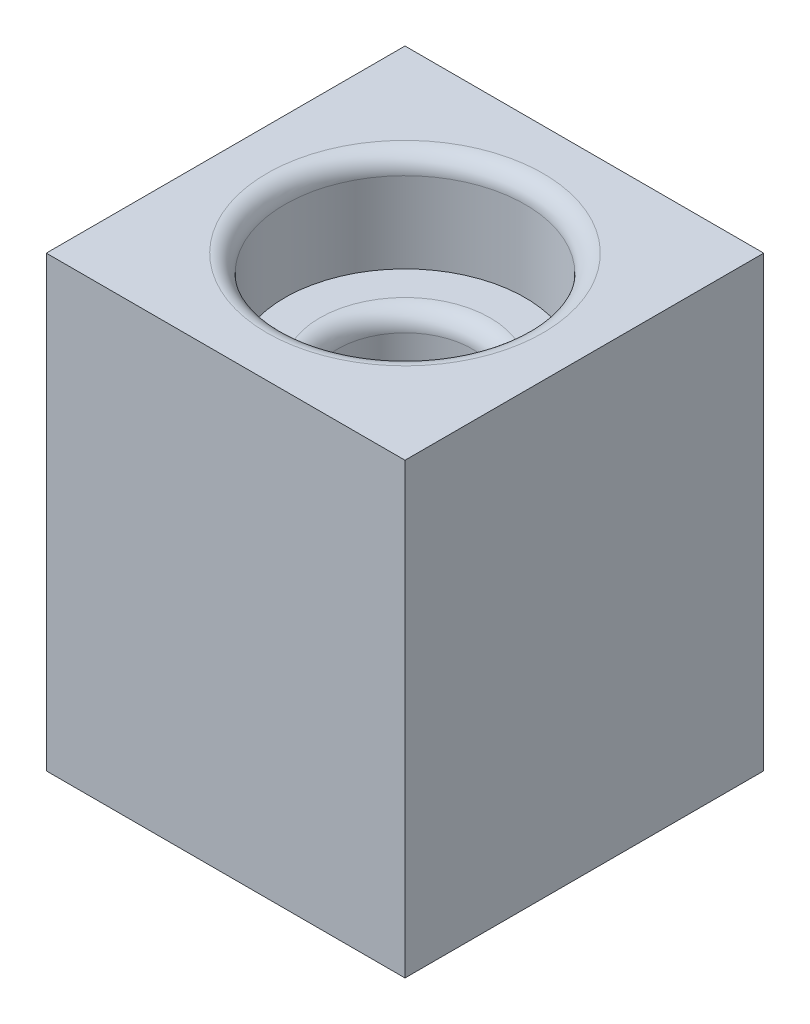
ISO-10303-21;
HEADER;
FILE_DESCRIPTION(('STEP AP214'),'2;1');
FILE_NAME('part.step','',(''),(''),'','','');
FILE_SCHEMA(('AUTOMOTIVE_DESIGN { 1 0 10303 214 1 1 1 1 }'));
ENDSEC;
DATA;
#1=APPLICATION_CONTEXT('core data for automotive mechanical design processes');
#2=APPLICATION_PROTOCOL_DEFINITION('international standard','automotive_design',2000,#1);
#3=PRODUCT_CONTEXT('',#1,'mechanical');
#4=PRODUCT('Part','Part','',(#3));
#5=PRODUCT_RELATED_PRODUCT_CATEGORY('part','',(#4));
#6=PRODUCT_DEFINITION_FORMATION('','',#4);
#7=PRODUCT_DEFINITION_CONTEXT('part definition',#1,'design');
#8=PRODUCT_DEFINITION('design','',#6,#7);
#9=PRODUCT_DEFINITION_SHAPE('','',#8);
#10=(LENGTH_UNIT() NAMED_UNIT(*) SI_UNIT(.MILLI.,.METRE.));
#11=(NAMED_UNIT(*) PLANE_ANGLE_UNIT() SI_UNIT($,.RADIAN.));
#12=(NAMED_UNIT(*) SI_UNIT($,.STERADIAN.) SOLID_ANGLE_UNIT());
#13=UNCERTAINTY_MEASURE_WITH_UNIT(LENGTH_MEASURE(1.E-05),#10,'distance_accuracy_value','');
#14=(GEOMETRIC_REPRESENTATION_CONTEXT(3) GLOBAL_UNCERTAINTY_ASSIGNED_CONTEXT((#13)) GLOBAL_UNIT_ASSIGNED_CONTEXT((#10,
#11,#12)) REPRESENTATION_CONTEXT('',''));
#15=CARTESIAN_POINT('',(0.,0.,0.));
#16=DIRECTION('',(0.,0.,1.));
#17=DIRECTION('',(1.,0.,0.));
#18=AXIS2_PLACEMENT_3D('',#15,#16,#17);
#19=CARTESIAN_POINT('',(0.,0.,0.));
#20=DIRECTION('',(0.,1.,0.));
#21=DIRECTION('',(0.,0.,1.));
#22=AXIS2_PLACEMENT_3D('',#19,#20,#21);
#23=CYLINDRICAL_SURFACE('',#22,3.75);
#24=CARTESIAN_POINT('',(0.,18.5,0.));
#25=DIRECTION('',(0.,1.,0.));
#26=DIRECTION('',(0.,0.,1.));
#27=AXIS2_PLACEMENT_3D('',#24,#25,#26);
#28=CIRCLE('',#27,3.75);
#29=CARTESIAN_POINT('',(0.,18.5,3.75));
#30=VERTEX_POINT('',#29);
#31=EDGE_CURVE('E42',#30,#30,#28,.T.);
#32=ORIENTED_EDGE('',*,*,#31,.T.);
#33=EDGE_LOOP('',(#32));
#34=FACE_BOUND('',#33,.T.);
#35=CARTESIAN_POINT('',(0.,6.5,0.));
#36=DIRECTION('',(0.,1.,0.));
#37=DIRECTION('',(0.,0.,1.));
#38=AXIS2_PLACEMENT_3D('',#35,#36,#37);
#39=CIRCLE('',#38,3.75);
#40=CARTESIAN_POINT('',(0.,6.5,3.75));
#41=VERTEX_POINT('',#40);
#42=EDGE_CURVE('E126',#41,#41,#39,.F.);
#43=ORIENTED_EDGE('',*,*,#42,.T.);
#44=EDGE_LOOP('',(#43));
#45=FACE_BOUND('',#44,.T.);
#46=ADVANCED_FACE('F33',(#34,#45),#23,.F.);
#47=CARTESIAN_POINT('',(-10.,25.,-10.));
#48=DIRECTION('',(1.,0.,0.));
#49=DIRECTION('',(0.,0.,-1.));
#50=AXIS2_PLACEMENT_3D('',#47,#48,#49);
#51=PLANE('',#50);
#52=DIRECTION('',(0.,0.,1.));
#53=VECTOR('',#52,1.);
#54=CARTESIAN_POINT('',(-10.,0.,-10.));
#55=LINE('',#54,#53);
#56=CARTESIAN_POINT('',(-10.,0.,-10.));
#57=VERTEX_POINT('',#56);
#58=CARTESIAN_POINT('',(-10.,0.,10.));
#59=VERTEX_POINT('',#58);
#60=EDGE_CURVE('E101',#57,#59,#55,.T.);
#61=ORIENTED_EDGE('',*,*,#60,.T.);
#62=DIRECTION('',(0.,-1.,0.));
#63=VECTOR('',#62,1.);
#64=CARTESIAN_POINT('',(-10.,25.,10.));
#65=LINE('',#64,#63);
#66=CARTESIAN_POINT('',(-10.,25.,10.));
#67=VERTEX_POINT('',#66);
#68=EDGE_CURVE('E92',#67,#59,#65,.T.);
#69=ORIENTED_EDGE('',*,*,#68,.F.);
#70=DIRECTION('',(0.,0.,1.));
#71=VECTOR('',#70,1.);
#72=CARTESIAN_POINT('',(-10.,25.,-10.));
#73=LINE('',#72,#71);
#74=CARTESIAN_POINT('',(-10.,25.,-10.));
#75=VERTEX_POINT('',#74);
#76=EDGE_CURVE('E86',#75,#67,#73,.T.);
#77=ORIENTED_EDGE('',*,*,#76,.F.);
#78=DIRECTION('',(0.,-1.,0.));
#79=VECTOR('',#78,1.);
#80=CARTESIAN_POINT('',(-10.,25.,-10.));
#81=LINE('',#80,#79);
#82=EDGE_CURVE('E97',#75,#57,#81,.T.);
#83=ORIENTED_EDGE('',*,*,#82,.T.);
#84=EDGE_LOOP('',(#61,#69,#77,#83));
#85=FACE_BOUND('',#84,.T.);
#86=ADVANCED_FACE('F171',(#85),#51,.F.);
#87=CARTESIAN_POINT('',(-10.,25.,10.));
#88=DIRECTION('',(0.,0.,-1.));
#89=DIRECTION('',(-1.,0.,0.));
#90=AXIS2_PLACEMENT_3D('',#87,#88,#89);
#91=PLANE('',#90);
#92=DIRECTION('',(1.,0.,0.));
#93=VECTOR('',#92,1.);
#94=CARTESIAN_POINT('',(-10.,0.,10.));
#95=LINE('',#94,#93);
#96=CARTESIAN_POINT('',(10.,0.,10.));
#97=VERTEX_POINT('',#96);
#98=EDGE_CURVE('E91',#59,#97,#95,.T.);
#99=ORIENTED_EDGE('',*,*,#98,.T.);
#100=DIRECTION('',(0.,-1.,0.));
#101=VECTOR('',#100,1.);
#102=CARTESIAN_POINT('',(10.,25.,10.));
#103=LINE('',#102,#101);
#104=CARTESIAN_POINT('',(10.,25.,10.));
#105=VERTEX_POINT('',#104);
#106=EDGE_CURVE('E89',#105,#97,#103,.T.);
#107=ORIENTED_EDGE('',*,*,#106,.F.);
#108=DIRECTION('',(1.,0.,0.));
#109=VECTOR('',#108,1.);
#110=CARTESIAN_POINT('',(-10.,25.,10.));
#111=LINE('',#110,#109);
#112=EDGE_CURVE('E81',#67,#105,#111,.T.);
#113=ORIENTED_EDGE('',*,*,#112,.F.);
#114=ORIENTED_EDGE('',*,*,#68,.T.);
#115=EDGE_LOOP('',(#99,#107,#113,#114));
#116=FACE_BOUND('',#115,.T.);
#117=ADVANCED_FACE('F90',(#116),#91,.F.);
#118=CARTESIAN_POINT('',(10.,25.,-10.));
#119=DIRECTION('',(-1.,0.,0.));
#120=DIRECTION('',(0.,0.,1.));
#121=AXIS2_PLACEMENT_3D('',#118,#119,#120);
#122=PLANE('',#121);
#123=DIRECTION('',(0.,0.,-1.));
#124=VECTOR('',#123,1.);
#125=CARTESIAN_POINT('',(10.,0.,-10.));
#126=LINE('',#125,#124);
#127=CARTESIAN_POINT('',(10.,0.,-10.));
#128=VERTEX_POINT('',#127);
#129=EDGE_CURVE('E67',#97,#128,#126,.T.);
#130=ORIENTED_EDGE('',*,*,#129,.T.);
#131=DIRECTION('',(0.,-1.,0.));
#132=VECTOR('',#131,1.);
#133=CARTESIAN_POINT('',(10.,25.,-10.));
#134=LINE('',#133,#132);
#135=CARTESIAN_POINT('',(10.,25.,-10.));
#136=VERTEX_POINT('',#135);
#137=EDGE_CURVE('E93',#136,#128,#134,.T.);
#138=ORIENTED_EDGE('',*,*,#137,.F.);
#139=DIRECTION('',(0.,0.,-1.));
#140=VECTOR('',#139,1.);
#141=CARTESIAN_POINT('',(10.,25.,-10.));
#142=LINE('',#141,#140);
#143=EDGE_CURVE('E84',#105,#136,#142,.T.);
#144=ORIENTED_EDGE('',*,*,#143,.F.);
#145=ORIENTED_EDGE('',*,*,#106,.T.);
#146=EDGE_LOOP('',(#130,#138,#144,#145));
#147=FACE_BOUND('',#146,.T.);
#148=ADVANCED_FACE('F95',(#147),#122,.F.);
#149=CARTESIAN_POINT('',(-10.,25.,-10.));
#150=DIRECTION('',(0.,0.,1.));
#151=DIRECTION('',(1.,0.,0.));
#152=AXIS2_PLACEMENT_3D('',#149,#150,#151);
#153=PLANE('',#152);
#154=DIRECTION('',(-1.,0.,0.));
#155=VECTOR('',#154,1.);
#156=CARTESIAN_POINT('',(-10.,0.,-10.));
#157=LINE('',#156,#155);
#158=EDGE_CURVE('E73',#128,#57,#157,.T.);
#159=ORIENTED_EDGE('',*,*,#158,.T.);
#160=ORIENTED_EDGE('',*,*,#82,.F.);
#161=DIRECTION('',(-1.,0.,0.));
#162=VECTOR('',#161,1.);
#163=CARTESIAN_POINT('',(-10.,25.,-10.));
#164=LINE('',#163,#162);
#165=EDGE_CURVE('E50',#136,#75,#164,.T.);
#166=ORIENTED_EDGE('',*,*,#165,.F.);
#167=ORIENTED_EDGE('',*,*,#137,.T.);
#168=EDGE_LOOP('',(#159,#160,#166,#167));
#169=FACE_BOUND('',#168,.T.);
#170=ADVANCED_FACE('F182',(#169),#153,.F.);
#171=CARTESIAN_POINT('',(0.,25.,0.));
#172=DIRECTION('',(0.,1.,0.));
#173=DIRECTION('',(0.,0.,1.));
#174=AXIS2_PLACEMENT_3D('',#171,#172,#173);
#175=PLANE('',#174);
#176=CARTESIAN_POINT('',(0.,25.,0.));
#177=DIRECTION('',(0.,1.,0.));
#178=DIRECTION('',(0.,0.,1.));
#179=AXIS2_PLACEMENT_3D('',#176,#177,#178);
#180=CIRCLE('',#179,7.7);
#181=CARTESIAN_POINT('',(0.,25.,7.7));
#182=VERTEX_POINT('',#181);
#183=EDGE_CURVE('E120',#182,#182,#180,.F.);
#184=ORIENTED_EDGE('',*,*,#183,.T.);
#185=EDGE_LOOP('',(#184));
#186=FACE_BOUND('',#185,.T.);
#187=ORIENTED_EDGE('',*,*,#76,.T.);
#188=ORIENTED_EDGE('',*,*,#112,.T.);
#189=ORIENTED_EDGE('',*,*,#143,.T.);
#190=ORIENTED_EDGE('',*,*,#165,.T.);
#191=EDGE_LOOP('',(#187,#188,#189,#190));
#192=FACE_BOUND('',#191,.T.);
#193=ADVANCED_FACE('F82',(#186,#192),#175,.T.);
#194=CARTESIAN_POINT('',(0.,0.,0.));
#195=DIRECTION('',(0.,1.,0.));
#196=DIRECTION('',(0.,0.,1.));
#197=AXIS2_PLACEMENT_3D('',#194,#195,#196);
#198=PLANE('',#197);
#199=CARTESIAN_POINT('',(0.,0.,0.));
#200=DIRECTION('',(0.,1.,0.));
#201=DIRECTION('',(0.,0.,1.));
#202=AXIS2_PLACEMENT_3D('',#199,#200,#201);
#203=CIRCLE('',#202,7.7);
#204=CARTESIAN_POINT('',(0.,0.,7.7));
#205=VERTEX_POINT('',#204);
#206=EDGE_CURVE('E111',#205,#205,#203,.T.);
#207=ORIENTED_EDGE('',*,*,#206,.T.);
#208=EDGE_LOOP('',(#207));
#209=FACE_BOUND('',#208,.T.);
#210=ORIENTED_EDGE('',*,*,#60,.F.);
#211=ORIENTED_EDGE('',*,*,#158,.F.);
#212=ORIENTED_EDGE('',*,*,#129,.F.);
#213=ORIENTED_EDGE('',*,*,#98,.F.);
#214=EDGE_LOOP('',(#210,#211,#212,#213));
#215=FACE_BOUND('',#214,.T.);
#216=ADVANCED_FACE('F143',(#209,#215),#198,.F.);
#217=CARTESIAN_POINT('',(0.,19.5,0.));
#218=DIRECTION('',(0.,1.,0.));
#219=DIRECTION('',(0.,0.,1.));
#220=AXIS2_PLACEMENT_3D('',#217,#218,#219);
#221=PLANE('',#220);
#222=CARTESIAN_POINT('',(0.,19.5,0.));
#223=DIRECTION('',(0.,1.,0.));
#224=DIRECTION('',(0.,0.,1.));
#225=AXIS2_PLACEMENT_3D('',#222,#223,#224);
#226=CIRCLE('',#225,4.75);
#227=CARTESIAN_POINT('',(0.,19.5,4.75));
#228=VERTEX_POINT('',#227);
#229=EDGE_CURVE('E123',#228,#228,#226,.F.);
#230=ORIENTED_EDGE('',*,*,#229,.T.);
#231=EDGE_LOOP('',(#230));
#232=FACE_BOUND('',#231,.T.);
#233=CARTESIAN_POINT('',(0.,19.5,0.));
#234=DIRECTION('',(0.,1.,0.));
#235=DIRECTION('',(0.,0.,1.));
#236=AXIS2_PLACEMENT_3D('',#233,#234,#235);
#237=CIRCLE('',#236,6.7);
#238=CARTESIAN_POINT('',(0.,19.5,6.7));
#239=VERTEX_POINT('',#238);
#240=EDGE_CURVE('E104',#239,#239,#237,.T.);
#241=ORIENTED_EDGE('',*,*,#240,.T.);
#242=EDGE_LOOP('',(#241));
#243=FACE_BOUND('',#242,.T.);
#244=ADVANCED_FACE('F139',(#232,#243),#221,.T.);
#245=CARTESIAN_POINT('',(0.,19.5,0.));
#246=DIRECTION('',(0.,1.,0.));
#247=DIRECTION('',(0.,0.,1.));
#248=AXIS2_PLACEMENT_3D('',#245,#246,#247);
#249=CYLINDRICAL_SURFACE('',#248,6.7);
#250=CARTESIAN_POINT('',(0.,24.,0.));
#251=DIRECTION('',(0.,1.,0.));
#252=DIRECTION('',(0.,0.,1.));
#253=AXIS2_PLACEMENT_3D('',#250,#251,#252);
#254=CIRCLE('',#253,6.7);
#255=CARTESIAN_POINT('',(0.,24.,6.7));
#256=VERTEX_POINT('',#255);
#257=EDGE_CURVE('E117',#256,#256,#254,.T.);
#258=ORIENTED_EDGE('',*,*,#257,.T.);
#259=EDGE_LOOP('',(#258));
#260=FACE_BOUND('',#259,.T.);
#261=ORIENTED_EDGE('',*,*,#240,.F.);
#262=EDGE_LOOP('',(#261));
#263=FACE_BOUND('',#262,.T.);
#264=ADVANCED_FACE('F142',(#260,#263),#249,.F.);
#265=CARTESIAN_POINT('',(0.,5.5,0.));
#266=DIRECTION('',(0.,1.,0.));
#267=DIRECTION('',(0.,0.,1.));
#268=AXIS2_PLACEMENT_3D('',#265,#266,#267);
#269=PLANE('',#268);
#270=CARTESIAN_POINT('',(0.,5.5,0.));
#271=DIRECTION('',(0.,1.,0.));
#272=DIRECTION('',(0.,0.,1.));
#273=AXIS2_PLACEMENT_3D('',#270,#271,#272);
#274=CIRCLE('',#273,4.75);
#275=CARTESIAN_POINT('',(0.,5.5,4.75));
#276=VERTEX_POINT('',#275);
#277=EDGE_CURVE('E11',#276,#276,#274,.T.);
#278=ORIENTED_EDGE('',*,*,#277,.T.);
#279=EDGE_LOOP('',(#278));
#280=FACE_BOUND('',#279,.T.);
#281=CARTESIAN_POINT('',(0.,5.5,0.));
#282=DIRECTION('',(0.,1.,0.));
#283=DIRECTION('',(0.,0.,1.));
#284=AXIS2_PLACEMENT_3D('',#281,#282,#283);
#285=CIRCLE('',#284,6.7);
#286=CARTESIAN_POINT('',(0.,5.5,6.7));
#287=VERTEX_POINT('',#286);
#288=EDGE_CURVE('E148',#287,#287,#285,.T.);
#289=ORIENTED_EDGE('',*,*,#288,.F.);
#290=EDGE_LOOP('',(#289));
#291=FACE_BOUND('',#290,.T.);
#292=ADVANCED_FACE('F156',(#280,#291),#269,.F.);
#293=CARTESIAN_POINT('',(0.,5.5,0.));
#294=DIRECTION('',(0.,-1.,0.));
#295=DIRECTION('',(0.,0.,-1.));
#296=AXIS2_PLACEMENT_3D('',#293,#294,#295);
#297=CYLINDRICAL_SURFACE('',#296,6.7);
#298=CARTESIAN_POINT('',(0.,1.,0.));
#299=DIRECTION('',(0.,1.,0.));
#300=DIRECTION('',(0.,0.,1.));
#301=AXIS2_PLACEMENT_3D('',#298,#299,#300);
#302=CIRCLE('',#301,6.7);
#303=CARTESIAN_POINT('',(0.,1.,6.7));
#304=VERTEX_POINT('',#303);
#305=EDGE_CURVE('E114',#304,#304,#302,.F.);
#306=ORIENTED_EDGE('',*,*,#305,.T.);
#307=EDGE_LOOP('',(#306));
#308=FACE_BOUND('',#307,.T.);
#309=ORIENTED_EDGE('',*,*,#288,.T.);
#310=EDGE_LOOP('',(#309));
#311=FACE_BOUND('',#310,.T.);
#312=ADVANCED_FACE('F154',(#308,#311),#297,.F.);
#313=CARTESIAN_POINT('',(0.,1.,0.));
#314=DIRECTION('',(0.,1.,0.));
#315=DIRECTION('',(0.,0.,1.));
#316=AXIS2_PLACEMENT_3D('',#313,#314,#315);
#317=TOROIDAL_SURFACE('',#316,7.7,1.);
#318=ORIENTED_EDGE('',*,*,#305,.F.);
#319=EDGE_LOOP('',(#318));
#320=FACE_BOUND('',#319,.T.);
#321=ORIENTED_EDGE('',*,*,#206,.F.);
#322=EDGE_LOOP('',(#321));
#323=FACE_BOUND('',#322,.T.);
#324=ADVANCED_FACE('F164',(#320,#323),#317,.T.);
#325=CARTESIAN_POINT('',(0.,24.,0.));
#326=DIRECTION('',(0.,1.,0.));
#327=DIRECTION('',(0.,0.,1.));
#328=AXIS2_PLACEMENT_3D('',#325,#326,#327);
#329=TOROIDAL_SURFACE('',#328,7.7,1.);
#330=ORIENTED_EDGE('',*,*,#183,.F.);
#331=EDGE_LOOP('',(#330));
#332=FACE_BOUND('',#331,.T.);
#333=ORIENTED_EDGE('',*,*,#257,.F.);
#334=EDGE_LOOP('',(#333));
#335=FACE_BOUND('',#334,.T.);
#336=ADVANCED_FACE('F136',(#332,#335),#329,.T.);
#337=CARTESIAN_POINT('',(0.,18.5,0.));
#338=DIRECTION('',(0.,1.,0.));
#339=DIRECTION('',(0.,0.,1.));
#340=AXIS2_PLACEMENT_3D('',#337,#338,#339);
#341=TOROIDAL_SURFACE('',#340,4.75,1.);
#342=ORIENTED_EDGE('',*,*,#31,.F.);
#343=EDGE_LOOP('',(#342));
#344=FACE_BOUND('',#343,.T.);
#345=ORIENTED_EDGE('',*,*,#229,.F.);
#346=EDGE_LOOP('',(#345));
#347=FACE_BOUND('',#346,.T.);
#348=ADVANCED_FACE('F133',(#344,#347),#341,.T.);
#349=CARTESIAN_POINT('',(0.,6.5,0.));
#350=DIRECTION('',(0.,1.,0.));
#351=DIRECTION('',(0.,0.,1.));
#352=AXIS2_PLACEMENT_3D('',#349,#350,#351);
#353=TOROIDAL_SURFACE('',#352,4.75,1.);
#354=ORIENTED_EDGE('',*,*,#277,.F.);
#355=EDGE_LOOP('',(#354));
#356=FACE_BOUND('',#355,.T.);
#357=ORIENTED_EDGE('',*,*,#42,.F.);
#358=EDGE_LOOP('',(#357));
#359=FACE_BOUND('',#358,.T.);
#360=ADVANCED_FACE('F35',(#356,#359),#353,.T.);
#361=CLOSED_SHELL('',(#46,#86,#117,#148,#170,#193,#216,#244,#264,#292,#312,#324,#336,#348,#360));
#362=MANIFOLD_SOLID_BREP('B2',#361);
#363=ADVANCED_BREP_SHAPE_REPRESENTATION('',(#18,#362),#14);
#364=SHAPE_DEFINITION_REPRESENTATION(#9,#363);
ENDSEC;
END-ISO-10303-21;
